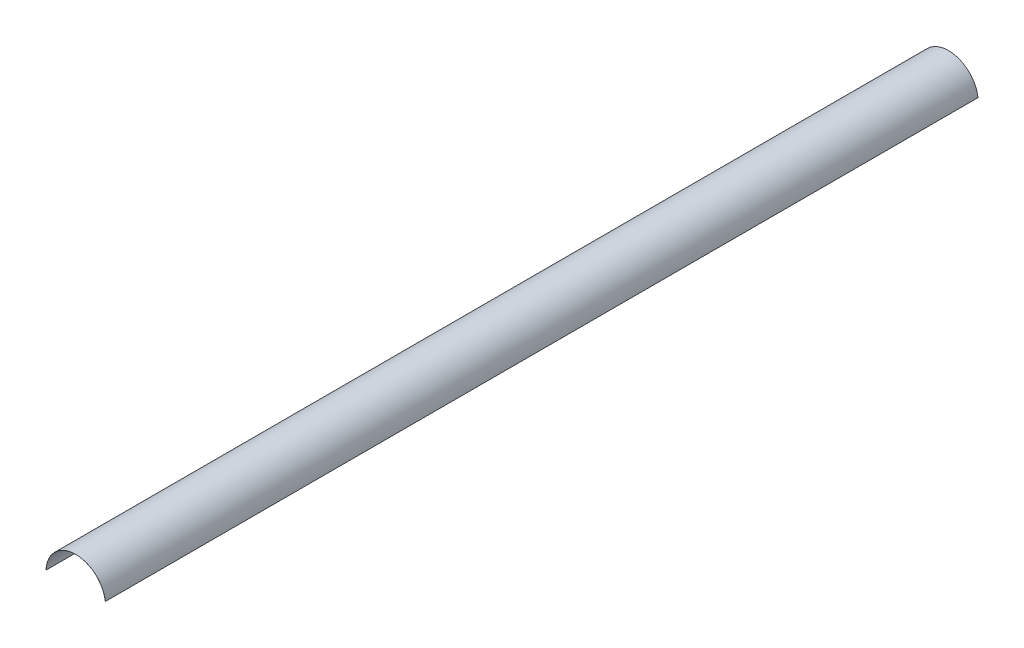
ISO-10303-21;
HEADER;
FILE_DESCRIPTION(('STEP AP214'),'2;1');
FILE_NAME('part.step','',(''),(''),'','','');
FILE_SCHEMA(('AUTOMOTIVE_DESIGN { 1 0 10303 214 1 1 1 1 }'));
ENDSEC;
DATA;
#1=APPLICATION_CONTEXT('core data for automotive mechanical design processes');
#2=APPLICATION_PROTOCOL_DEFINITION('international standard','automotive_design',2000,#1);
#3=PRODUCT_CONTEXT('',#1,'mechanical');
#4=PRODUCT('Part','Part','',(#3));
#5=PRODUCT_RELATED_PRODUCT_CATEGORY('part','',(#4));
#6=PRODUCT_DEFINITION_FORMATION('','',#4);
#7=PRODUCT_DEFINITION_CONTEXT('part definition',#1,'design');
#8=PRODUCT_DEFINITION('design','',#6,#7);
#9=PRODUCT_DEFINITION_SHAPE('','',#8);
#10=(LENGTH_UNIT() NAMED_UNIT(*) SI_UNIT(.MILLI.,.METRE.));
#11=(NAMED_UNIT(*) PLANE_ANGLE_UNIT() SI_UNIT($,.RADIAN.));
#12=(NAMED_UNIT(*) SI_UNIT($,.STERADIAN.) SOLID_ANGLE_UNIT());
#13=UNCERTAINTY_MEASURE_WITH_UNIT(LENGTH_MEASURE(1.E-05),#10,'distance_accuracy_value','');
#14=(GEOMETRIC_REPRESENTATION_CONTEXT(3) GLOBAL_UNCERTAINTY_ASSIGNED_CONTEXT((#13)) GLOBAL_UNIT_ASSIGNED_CONTEXT((#10,
#11,#12)) REPRESENTATION_CONTEXT('',''));
#15=CARTESIAN_POINT('',(0.,0.,0.));
#16=DIRECTION('',(0.,0.,1.));
#17=DIRECTION('',(1.,0.,0.));
#18=AXIS2_PLACEMENT_3D('',#15,#16,#17);
#19=CARTESIAN_POINT('',(103.971618925174,-4.37914700809364,3048.));
#20=DIRECTION('',(0.,0.,-1.));
#21=DIRECTION('',(-1.,0.,0.));
#22=AXIS2_PLACEMENT_3D('',#19,#20,#21);
#23=CYLINDRICAL_SURFACE('',#22,103.9368);
#24=CARTESIAN_POINT('',(103.971618925174,-4.37914700809364,0.));
#25=DIRECTION('',(0.,0.,1.));
#26=DIRECTION('',(1.,0.,0.));
#27=AXIS2_PLACEMENT_3D('',#24,#25,#26);
#28=CIRCLE('',#27,103.9368);
#29=CARTESIAN_POINT('',(0.126887501739281,-0.00534433366867169,0.));
#30=VERTEX_POINT('',#29);
#31=CARTESIAN_POINT('',(207.085560906763,8.67356777686452,0.));
#32=VERTEX_POINT('',#31);
#33=EDGE_CURVE('E97',#30,#32,#28,.F.);
#34=ORIENTED_EDGE('',*,*,#33,.T.);
#35=DIRECTION('',(0.,0.,-1.));
#36=VECTOR('',#35,1.);
#37=CARTESIAN_POINT('',(207.085560906763,8.67356777686452,3048.));
#38=LINE('',#37,#36);
#39=CARTESIAN_POINT('',(207.085560906763,8.67356777686452,3048.));
#40=VERTEX_POINT('',#39);
#41=EDGE_CURVE('E11',#40,#32,#38,.T.);
#42=ORIENTED_EDGE('',*,*,#41,.F.);
#43=CARTESIAN_POINT('',(103.971618925174,-4.37914700809364,3048.));
#44=DIRECTION('',(0.,0.,1.));
#45=DIRECTION('',(1.,0.,0.));
#46=AXIS2_PLACEMENT_3D('',#43,#44,#45);
#47=CIRCLE('',#46,103.9368);
#48=CARTESIAN_POINT('',(0.126887501739281,-0.00534433366867169,3048.));
#49=VERTEX_POINT('',#48);
#50=EDGE_CURVE('E74',#49,#40,#47,.F.);
#51=ORIENTED_EDGE('',*,*,#50,.F.);
#52=DIRECTION('',(0.,0.,-1.));
#53=VECTOR('',#52,1.);
#54=CARTESIAN_POINT('',(0.126887501739281,-0.00534433366867169,3048.));
#55=LINE('',#54,#53);
#56=EDGE_CURVE('E50',#49,#30,#55,.T.);
#57=ORIENTED_EDGE('',*,*,#56,.T.);
#58=EDGE_LOOP('',(#34,#42,#51,#57));
#59=FACE_BOUND('',#58,.T.);
#60=ADVANCED_FACE('F34',(#59),#23,.F.);
#61=CARTESIAN_POINT('',(207.211555459526,8.68951684185103,3048.));
#62=DIRECTION('',(0.125583188870166,-0.992083092625411,0.));
#63=DIRECTION('',(0.992083092625411,0.125583188870166,0.));
#64=AXIS2_PLACEMENT_3D('',#61,#62,#63);
#65=PLANE('',#64);
#66=DIRECTION('',(-0.992083092625411,-0.125583188870166,0.));
#67=VECTOR('',#66,1.);
#68=CARTESIAN_POINT('',(207.211555459526,8.68951684185103,0.));
#69=LINE('',#68,#67);
#70=CARTESIAN_POINT('',(207.211555459526,8.68951684185103,0.));
#71=VERTEX_POINT('',#70);
#72=EDGE_CURVE('E83',#71,#32,#69,.T.);
#73=ORIENTED_EDGE('',*,*,#72,.F.);
#74=DIRECTION('',(0.,0.,-1.));
#75=VECTOR('',#74,1.);
#76=CARTESIAN_POINT('',(207.211555459526,8.68951684185103,3048.));
#77=LINE('',#76,#75);
#78=CARTESIAN_POINT('',(207.211555459526,8.68951684185103,3048.));
#79=VERTEX_POINT('',#78);
#80=EDGE_CURVE('E42',#79,#71,#77,.T.);
#81=ORIENTED_EDGE('',*,*,#80,.F.);
#82=DIRECTION('',(-0.992083092625411,-0.125583188870166,0.));
#83=VECTOR('',#82,1.);
#84=CARTESIAN_POINT('',(207.211555459526,8.68951684185103,3048.));
#85=LINE('',#84,#83);
#86=EDGE_CURVE('E81',#79,#40,#85,.T.);
#87=ORIENTED_EDGE('',*,*,#86,.T.);
#88=ORIENTED_EDGE('',*,*,#41,.T.);
#89=EDGE_LOOP('',(#73,#81,#87,#88));
#90=FACE_BOUND('',#89,.T.);
#91=ADVANCED_FACE('F80',(#90),#65,.T.);
#92=CARTESIAN_POINT('',(103.971618925174,-4.37914700809364,3048.));
#93=DIRECTION('',(0.,0.,-1.));
#94=DIRECTION('',(-1.,0.,0.));
#95=AXIS2_PLACEMENT_3D('',#92,#93,#94);
#96=CYLINDRICAL_SURFACE('',#95,104.0638);
#97=CARTESIAN_POINT('',(103.971618925174,-4.37914700809364,0.));
#98=DIRECTION('',(0.,0.,-1.));
#99=DIRECTION('',(-1.,0.,0.));
#100=AXIS2_PLACEMENT_3D('',#97,#98,#99);
#101=CIRCLE('',#100,104.0638);
#102=CARTESIAN_POINT('',(0.,0.,0.));
#103=VERTEX_POINT('',#102);
#104=EDGE_CURVE('E100',#103,#71,#101,.T.);
#105=ORIENTED_EDGE('',*,*,#104,.F.);
#106=DIRECTION('',(0.,0.,-1.));
#107=VECTOR('',#106,1.);
#108=CARTESIAN_POINT('',(0.,0.,3048.));
#109=LINE('',#108,#107);
#110=CARTESIAN_POINT('',(0.,0.,3048.));
#111=VERTEX_POINT('',#110);
#112=EDGE_CURVE('E63',#111,#103,#109,.T.);
#113=ORIENTED_EDGE('',*,*,#112,.F.);
#114=CARTESIAN_POINT('',(103.971618925174,-4.37914700809364,3048.));
#115=DIRECTION('',(0.,0.,-1.));
#116=DIRECTION('',(-1.,0.,0.));
#117=AXIS2_PLACEMENT_3D('',#114,#115,#116);
#118=CIRCLE('',#117,104.0638);
#119=EDGE_CURVE('E89',#111,#79,#118,.T.);
#120=ORIENTED_EDGE('',*,*,#119,.T.);
#121=ORIENTED_EDGE('',*,*,#80,.T.);
#122=EDGE_LOOP('',(#105,#113,#120,#121));
#123=FACE_BOUND('',#122,.T.);
#124=ADVANCED_FACE('F91',(#123),#96,.T.);
#125=CARTESIAN_POINT('',(0.126887501739281,-0.00534433366867169,3048.));
#126=DIRECTION('',(-0.0420813674698536,-0.99911418692353,0.));
#127=DIRECTION('',(0.99911418692353,-0.0420813674698536,0.));
#128=AXIS2_PLACEMENT_3D('',#125,#126,#127);
#129=PLANE('',#128);
#130=DIRECTION('',(-0.99911418692353,0.0420813674698536,0.));
#131=VECTOR('',#130,1.);
#132=CARTESIAN_POINT('',(0.126887501739281,-0.00534433366867169,0.));
#133=LINE('',#132,#131);
#134=EDGE_CURVE('E102',#30,#103,#133,.T.);
#135=ORIENTED_EDGE('',*,*,#134,.F.);
#136=ORIENTED_EDGE('',*,*,#56,.F.);
#137=DIRECTION('',(-0.99911418692353,0.0420813674698536,0.));
#138=VECTOR('',#137,1.);
#139=CARTESIAN_POINT('',(0.126887501739281,-0.00534433366867169,3048.));
#140=LINE('',#139,#138);
#141=EDGE_CURVE('E92',#49,#111,#140,.T.);
#142=ORIENTED_EDGE('',*,*,#141,.T.);
#143=ORIENTED_EDGE('',*,*,#112,.T.);
#144=EDGE_LOOP('',(#135,#136,#142,#143));
#145=FACE_BOUND('',#144,.T.);
#146=ADVANCED_FACE('F108',(#145),#129,.T.);
#147=CARTESIAN_POINT('',(103.971618925174,-4.37914700809364,3048.));
#148=DIRECTION('',(0.,0.,1.));
#149=DIRECTION('',(1.,0.,0.));
#150=AXIS2_PLACEMENT_3D('',#147,#148,#149);
#151=PLANE('',#150);
#152=ORIENTED_EDGE('',*,*,#50,.T.);
#153=ORIENTED_EDGE('',*,*,#86,.F.);
#154=ORIENTED_EDGE('',*,*,#119,.F.);
#155=ORIENTED_EDGE('',*,*,#141,.F.);
#156=EDGE_LOOP('',(#152,#153,#154,#155));
#157=FACE_BOUND('',#156,.T.);
#158=ADVANCED_FACE('F88',(#157),#151,.T.);
#159=CARTESIAN_POINT('',(103.971618925174,-4.37914700809364,0.));
#160=DIRECTION('',(0.,0.,1.));
#161=DIRECTION('',(1.,0.,0.));
#162=AXIS2_PLACEMENT_3D('',#159,#160,#161);
#163=PLANE('',#162);
#164=ORIENTED_EDGE('',*,*,#33,.F.);
#165=ORIENTED_EDGE('',*,*,#134,.T.);
#166=ORIENTED_EDGE('',*,*,#104,.T.);
#167=ORIENTED_EDGE('',*,*,#72,.T.);
#168=EDGE_LOOP('',(#164,#165,#166,#167));
#169=FACE_BOUND('',#168,.T.);
#170=ADVANCED_FACE('F107',(#169),#163,.F.);
#171=CLOSED_SHELL('',(#60,#91,#124,#146,#158,#170));
#172=MANIFOLD_SOLID_BREP('B2',#171);
#173=ADVANCED_BREP_SHAPE_REPRESENTATION('',(#18,#172),#14);
#174=SHAPE_DEFINITION_REPRESENTATION(#9,#173);
ENDSEC;
END-ISO-10303-21;
